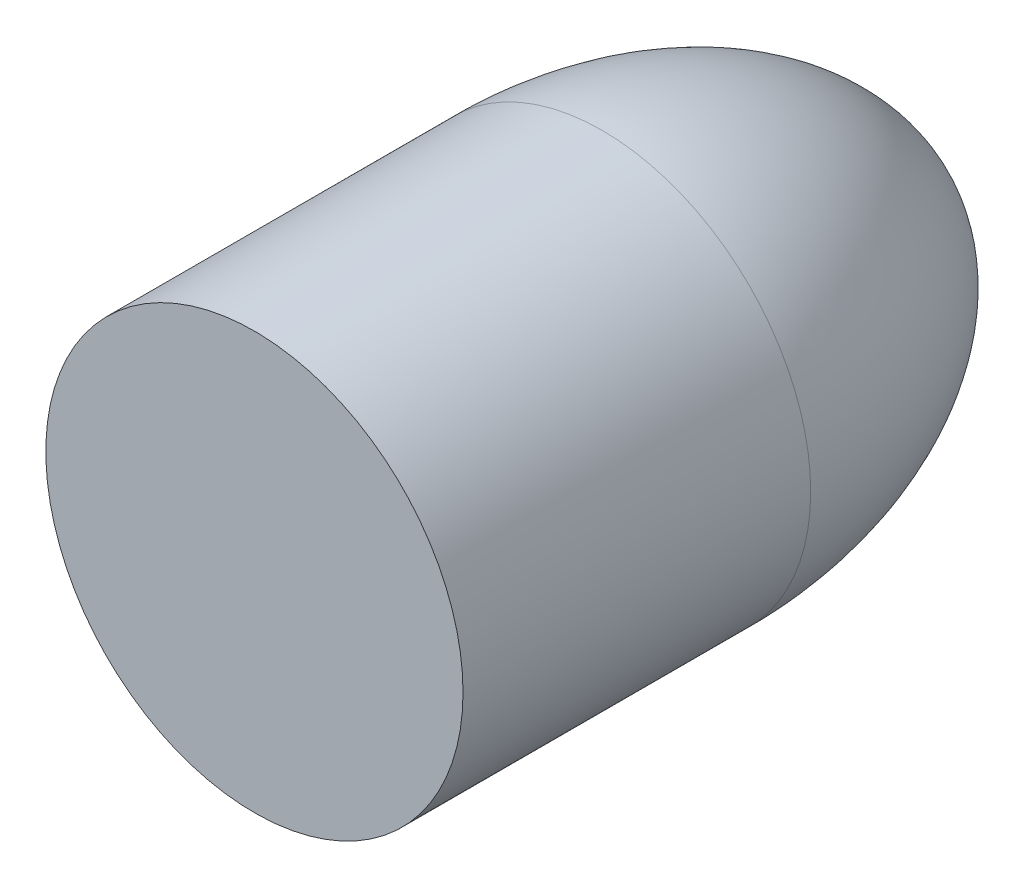
ISO-10303-21;
HEADER;
FILE_DESCRIPTION(('STEP AP214'),'2;1');
FILE_NAME('part.step','',(''),(''),'','','');
FILE_SCHEMA(('AUTOMOTIVE_DESIGN { 1 0 10303 214 1 1 1 1 }'));
ENDSEC;
DATA;
#1=APPLICATION_CONTEXT('core data for automotive mechanical design processes');
#2=APPLICATION_PROTOCOL_DEFINITION('international standard','automotive_design',2000,#1);
#3=PRODUCT_CONTEXT('',#1,'mechanical');
#4=PRODUCT('Part','Part','',(#3));
#5=PRODUCT_RELATED_PRODUCT_CATEGORY('part','',(#4));
#6=PRODUCT_DEFINITION_FORMATION('','',#4);
#7=PRODUCT_DEFINITION_CONTEXT('part definition',#1,'design');
#8=PRODUCT_DEFINITION('design','',#6,#7);
#9=PRODUCT_DEFINITION_SHAPE('','',#8);
#10=(LENGTH_UNIT() NAMED_UNIT(*) SI_UNIT(.MILLI.,.METRE.));
#11=(NAMED_UNIT(*) PLANE_ANGLE_UNIT() SI_UNIT($,.RADIAN.));
#12=(NAMED_UNIT(*) SI_UNIT($,.STERADIAN.) SOLID_ANGLE_UNIT());
#13=UNCERTAINTY_MEASURE_WITH_UNIT(LENGTH_MEASURE(1.E-05),#10,'distance_accuracy_value','');
#14=(GEOMETRIC_REPRESENTATION_CONTEXT(3) GLOBAL_UNCERTAINTY_ASSIGNED_CONTEXT((#13)) GLOBAL_UNIT_ASSIGNED_CONTEXT((#10,
#11,#12)) REPRESENTATION_CONTEXT('',''));
#15=CARTESIAN_POINT('',(0.,0.,0.));
#16=DIRECTION('',(0.,0.,1.));
#17=DIRECTION('',(1.,0.,0.));
#18=AXIS2_PLACEMENT_3D('',#15,#16,#17);
#19=CARTESIAN_POINT('',(0.,0.,127.));
#20=DIRECTION('',(0.,0.,-1.));
#21=DIRECTION('',(-1.,0.,0.));
#22=AXIS2_PLACEMENT_3D('',#19,#20,#21);
#23=CYLINDRICAL_SURFACE('',#22,76.2);
#24=CARTESIAN_POINT('',(0.,0.,127.));
#25=DIRECTION('',(0.,0.,1.));
#26=DIRECTION('',(1.,0.,0.));
#27=AXIS2_PLACEMENT_3D('',#24,#25,#26);
#28=CIRCLE('',#27,76.2);
#29=CARTESIAN_POINT('',(76.2,0.,127.));
#30=VERTEX_POINT('',#29);
#31=EDGE_CURVE('E11',#30,#30,#28,.T.);
#32=ORIENTED_EDGE('',*,*,#31,.F.);
#33=EDGE_LOOP('',(#32));
#34=FACE_BOUND('',#33,.T.);
#35=CARTESIAN_POINT('',(0.,0.,0.));
#36=DIRECTION('',(0.,0.,1.));
#37=DIRECTION('',(1.,0.,0.));
#38=AXIS2_PLACEMENT_3D('',#35,#36,#37);
#39=CIRCLE('',#38,76.2);
#40=CARTESIAN_POINT('',(76.2,0.,0.));
#41=VERTEX_POINT('',#40);
#42=EDGE_CURVE('E54',#41,#41,#39,.T.);
#43=ORIENTED_EDGE('',*,*,#42,.T.);
#44=EDGE_LOOP('',(#43));
#45=FACE_BOUND('',#44,.T.);
#46=ADVANCED_FACE('F43',(#34,#45),#23,.T.);
#47=CARTESIAN_POINT('',(0.,0.,127.));
#48=DIRECTION('',(0.,0.,1.));
#49=DIRECTION('',(1.,0.,0.));
#50=AXIS2_PLACEMENT_3D('',#47,#48,#49);
#51=PLANE('',#50);
#52=ORIENTED_EDGE('',*,*,#31,.T.);
#53=EDGE_LOOP('',(#52));
#54=FACE_BOUND('',#53,.T.);
#55=ADVANCED_FACE('F59',(#54),#51,.T.);
#56=CARTESIAN_POINT('',(0.,0.,-114.3));
#57=CARTESIAN_POINT('',(0.,1.26330219133907,-114.299994137822));
#58=CARTESIAN_POINT('',(0.,3.97204471614745,-114.210195468034));
#59=CARTESIAN_POINT('',(0.,7.80464057438416,-113.809196713139));
#60=CARTESIAN_POINT('',(0.,12.6931151758074,-112.800694333328));
#61=CARTESIAN_POINT('',(0.,17.3445738228845,-111.381650727247));
#62=CARTESIAN_POINT('',(0.,21.5774252304688,-109.702256704587));
#63=CARTESIAN_POINT('',(0.,25.6667958983595,-107.699766518636));
#64=CARTESIAN_POINT('',(0.,29.5977381415592,-105.402899199473));
#65=CARTESIAN_POINT('',(0.,33.3602776931529,-102.840224577595));
#66=CARTESIAN_POINT('',(0.,36.9483913320348,-100.039148354122));
#67=CARTESIAN_POINT('',(0.,40.35923758389,-97.0253003471767));
#68=CARTESIAN_POINT('',(0.,43.5924689387282,-93.8220759192269));
#69=CARTESIAN_POINT('',(0.,46.6494668712589,-90.4506358738019));
#70=CARTESIAN_POINT('',(0.,50.1370579224414,-86.1921328462645));
#71=CARTESIAN_POINT('',(0.,54.0276975563519,-80.8060180348697));
#72=CARTESIAN_POINT('',(0.,58.1308705721071,-74.1902030496914));
#73=CARTESIAN_POINT('',(0.,62.2371216034753,-66.2688937321422));
#74=CARTESIAN_POINT('',(0.,65.834058820961,-57.9042312084179));
#75=CARTESIAN_POINT('',(0.,68.4865506546675,-50.3925519935018));
#76=CARTESIAN_POINT('',(0.,70.4218786063783,-43.8467502189126));
#77=CARTESIAN_POINT('',(0.,71.815393586735,-38.333028517102));
#78=CARTESIAN_POINT('',(0.,72.8008733089059,-33.8914246355848));
#79=CARTESIAN_POINT('',(0.,73.6589765014044,-29.4234441681929));
#80=CARTESIAN_POINT('',(0.,74.3913984578519,-24.9332481102207));
#81=CARTESIAN_POINT('',(0.,74.9235565876387,-20.9880192645678));
#82=CARTESIAN_POINT('',(0.,75.3027855154137,-17.5973021691661));
#83=CARTESIAN_POINT('',(0.,75.5678341673323,-14.7662345698594));
#84=CARTESIAN_POINT('',(0.,75.749391058914,-12.4994603101605));
#85=CARTESIAN_POINT('',(0.,75.9005541267076,-10.2286143006029));
#86=CARTESIAN_POINT('',(0.,76.0213967606802,-7.9605739398501));
#87=CARTESIAN_POINT('',(0.,76.1006549534268,-5.96381422602081));
#88=CARTESIAN_POINT('',(0.,76.1497043276645,-4.27340690798473));
#89=CARTESIAN_POINT('',(0.,76.1779971264918,-2.84636304179104));
#90=CARTESIAN_POINT('',(0.,76.193085097219,-1.66536256904535));
#91=CARTESIAN_POINT('',(0.,76.198742743909,-0.793671564099988));
#92=CARTESIAN_POINT('',(0.,76.1999999999999,-0.264306544408299));
#93=CARTESIAN_POINT('',(0.,76.1999999999999,2.97850022128159E-13));
#94=B_SPLINE_CURVE_WITH_KNOTS('',4,(#56,#57,#58,#59,#60,#61,#62,#63,#64,#65,#66,#67,#68,#69,#70,
#71,#72,#73,#74,#75,#76,#77,#78,#79,#80,#81,#82,#83,#84,#85,#86,#87,#88,#89,#90,#91,#92,#93),
.UNSPECIFIED.,.F.,.F.,(5,1,1,1,1,1,1,1,1,1,1,1,1,1,1,1,1,1,1,1,1,1,1,1,1,1,1,1,1,1,1,1,1,1,5),
(0.0703662393085655,0.10145065048678,0.137022605397886,0.16500769032057,0.192992767830702,
0.220976537202184,0.248959652279895,0.276943971978805,0.304927647227552,0.332911759217212,
0.360895795110723,0.388879752435203,0.416863810857693,0.444847788309007,0.496286819717196,
0.552254914974898,0.608223055906556,0.66419119367311,0.720159325778084,0.748143393069441,
0.776127460360798,0.804111526995257,0.832095593629715,0.860079660363086,0.888063727096458,
0.90205576176817,0.916047796439881,0.930039831111593,0.944031865783304,0.958023899337478,
0.972015932891652,0.979011949668739,0.986007966445826,0.993003983222913,1.),.UNSPECIFIED.);
#95=CARTESIAN_POINT('',(0.,0.,-480.060000000396));
#96=DIRECTION('',(0.,0.,-1.));
#97=AXIS1_PLACEMENT('',#95,#96);
#98=SURFACE_OF_REVOLUTION('',#94,#97);
#99=ORIENTED_EDGE('',*,*,#42,.F.);
#100=EDGE_LOOP('',(#99));
#101=FACE_BOUND('',#100,.T.);
#102=CARTESIAN_POINT('',(0.,0.,-114.3));
#103=VERTEX_POINT('',#102);
#104=VERTEX_LOOP('',#103);
#105=FACE_BOUND('',#104,.T.);
#106=ADVANCED_FACE('F45',(#101,#105),#98,.F.);
#107=CLOSED_SHELL('',(#46,#55,#106));
#108=MANIFOLD_SOLID_BREP('B2',#107);
#109=ADVANCED_BREP_SHAPE_REPRESENTATION('',(#18,#108),#14);
#110=SHAPE_DEFINITION_REPRESENTATION(#9,#109);
ENDSEC;
END-ISO-10303-21;
